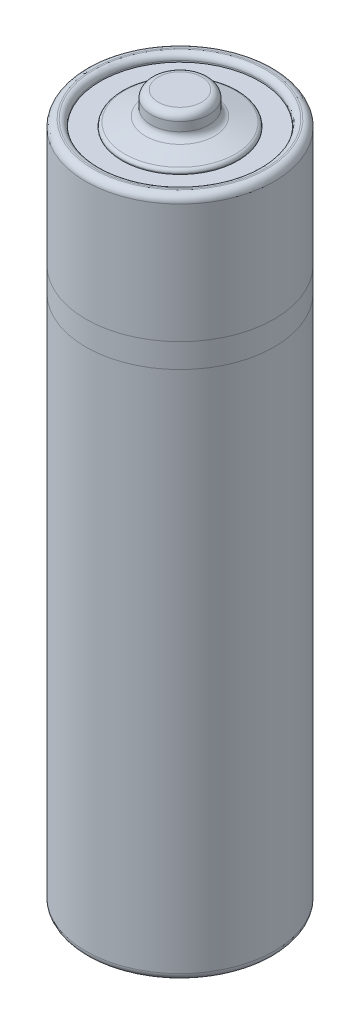
ISO-10303-21;
HEADER;
FILE_DESCRIPTION(('STEP AP214'),'2;1');
FILE_NAME('part.step','',(''),(''),'','','');
FILE_SCHEMA(('AUTOMOTIVE_DESIGN { 1 0 10303 214 1 1 1 1 }'));
ENDSEC;
DATA;
#1=APPLICATION_CONTEXT('core data for automotive mechanical design processes');
#2=APPLICATION_PROTOCOL_DEFINITION('international standard','automotive_design',2000,#1);
#3=PRODUCT_CONTEXT('',#1,'mechanical');
#4=PRODUCT('Part','Part','',(#3));
#5=PRODUCT_RELATED_PRODUCT_CATEGORY('part','',(#4));
#6=PRODUCT_DEFINITION_FORMATION('','',#4);
#7=PRODUCT_DEFINITION_CONTEXT('part definition',#1,'design');
#8=PRODUCT_DEFINITION('design','',#6,#7);
#9=PRODUCT_DEFINITION_SHAPE('','',#8);
#10=(LENGTH_UNIT() NAMED_UNIT(*) SI_UNIT(.MILLI.,.METRE.));
#11=(NAMED_UNIT(*) PLANE_ANGLE_UNIT() SI_UNIT($,.RADIAN.));
#12=(NAMED_UNIT(*) SI_UNIT($,.STERADIAN.) SOLID_ANGLE_UNIT());
#13=UNCERTAINTY_MEASURE_WITH_UNIT(LENGTH_MEASURE(1.E-05),#10,'distance_accuracy_value','');
#14=(GEOMETRIC_REPRESENTATION_CONTEXT(3) GLOBAL_UNCERTAINTY_ASSIGNED_CONTEXT((#13)) GLOBAL_UNIT_ASSIGNED_CONTEXT((#10,
#11,#12)) REPRESENTATION_CONTEXT('',''));
#15=CARTESIAN_POINT('',(0.,0.,0.));
#16=DIRECTION('',(0.,0.,1.));
#17=DIRECTION('',(1.,0.,0.));
#18=AXIS2_PLACEMENT_3D('',#15,#16,#17);
#19=CARTESIAN_POINT('',(0.,54.3178324547757,0.));
#20=DIRECTION('',(0.,1.,0.));
#21=DIRECTION('',(0.,0.,1.));
#22=AXIS2_PLACEMENT_3D('',#19,#20,#21);
#23=CYLINDRICAL_SURFACE('',#22,6.5);
#24=CARTESIAN_POINT('',(0.,-23.825,0.));
#25=DIRECTION('',(0.,1.,0.));
#26=DIRECTION('',(0.,0.,1.));
#27=AXIS2_PLACEMENT_3D('',#24,#25,#26);
#28=CIRCLE('',#27,6.5);
#29=CARTESIAN_POINT('',(0.,-23.825,6.5));
#30=VERTEX_POINT('',#29);
#31=EDGE_CURVE('E72',#30,#30,#28,.T.);
#32=ORIENTED_EDGE('',*,*,#31,.T.);
#33=EDGE_LOOP('',(#32));
#34=FACE_BOUND('',#33,.T.);
#35=CARTESIAN_POINT('',(0.,12.282906776427,0.));
#36=DIRECTION('',(0.,1.,0.));
#37=DIRECTION('',(0.,0.,1.));
#38=AXIS2_PLACEMENT_3D('',#35,#36,#37);
#39=CIRCLE('',#38,6.5);
#40=CARTESIAN_POINT('',(0.,12.282906776427,6.5));
#41=VERTEX_POINT('',#40);
#42=EDGE_CURVE('E10',#41,#41,#39,.T.);
#43=ORIENTED_EDGE('',*,*,#42,.F.);
#44=EDGE_LOOP('',(#43));
#45=FACE_BOUND('',#44,.T.);
#46=ADVANCED_FACE('F34',(#34,#45),#23,.T.);
#47=CARTESIAN_POINT('',(0.,22.175,0.));
#48=DIRECTION('',(0.,-1.,0.));
#49=DIRECTION('',(0.,0.,-1.));
#50=AXIS2_PLACEMENT_3D('',#47,#48,#49);
#51=CIRCLE('',#50,6.5);
#52=CARTESIAN_POINT('',(0.,22.175,-6.5));
#53=VERTEX_POINT('',#52);
#54=EDGE_CURVE('E99',#53,#53,#51,.T.);
#55=ORIENTED_EDGE('',*,*,#54,.T.);
#56=EDGE_LOOP('',(#55));
#57=FACE_BOUND('',#56,.T.);
#58=CARTESIAN_POINT('',(0.,13.9515340667371,0.));
#59=DIRECTION('',(0.,-1.,0.));
#60=DIRECTION('',(0.,0.,-1.));
#61=AXIS2_PLACEMENT_3D('',#58,#59,#60);
#62=CIRCLE('',#61,6.5);
#63=CARTESIAN_POINT('',(0.,13.9515340667371,-6.5));
#64=VERTEX_POINT('',#63);
#65=EDGE_CURVE('E42',#64,#64,#62,.T.);
#66=ORIENTED_EDGE('',*,*,#65,.F.);
#67=EDGE_LOOP('',(#66));
#68=FACE_BOUND('',#67,.T.);
#69=ADVANCED_FACE('F141',(#57,#68),#23,.T.);
#70=CARTESIAN_POINT('',(0.,-24.425,0.));
#71=DIRECTION('',(0.,1.,0.));
#72=DIRECTION('',(0.,0.,1.));
#73=AXIS2_PLACEMENT_3D('',#70,#71,#72);
#74=PLANE('',#73);
#75=CARTESIAN_POINT('',(0.,-24.425,0.));
#76=DIRECTION('',(0.,1.,0.));
#77=DIRECTION('',(0.,0.,1.));
#78=AXIS2_PLACEMENT_3D('',#75,#76,#77);
#79=CIRCLE('',#78,0.749999999999992);
#80=CARTESIAN_POINT('',(0.,-24.425,0.749999999999992));
#81=VERTEX_POINT('',#80);
#82=EDGE_CURVE('E105',#81,#81,#79,.T.);
#83=ORIENTED_EDGE('',*,*,#82,.F.);
#84=EDGE_LOOP('',(#83));
#85=FACE_BOUND('',#84,.T.);
#86=ADVANCED_FACE('F147',(#85),#74,.F.);
#87=CARTESIAN_POINT('',(0.749999999999992,-24.175,0.));
#88=DIRECTION('',(0.,1.,0.));
#89=DIRECTION('',(0.,0.,1.));
#90=AXIS2_PLACEMENT_3D('',#87,#88,#89);
#91=PLANE('',#90);
#92=CARTESIAN_POINT('',(0.,-24.175,0.));
#93=DIRECTION('',(0.,1.,0.));
#94=DIRECTION('',(0.,0.,1.));
#95=AXIS2_PLACEMENT_3D('',#92,#93,#94);
#96=CIRCLE('',#95,0.999999999999987);
#97=CARTESIAN_POINT('',(0.,-24.175,0.999999999999987));
#98=VERTEX_POINT('',#97);
#99=EDGE_CURVE('E49',#98,#98,#96,.T.);
#100=ORIENTED_EDGE('',*,*,#99,.T.);
#101=EDGE_LOOP('',(#100));
#102=FACE_BOUND('',#101,.T.);
#103=CARTESIAN_POINT('',(0.,-24.175,0.));
#104=DIRECTION('',(0.,1.,0.));
#105=DIRECTION('',(0.,0.,1.));
#106=AXIS2_PLACEMENT_3D('',#103,#104,#105);
#107=CIRCLE('',#106,2.15000000000001);
#108=CARTESIAN_POINT('',(0.,-24.175,2.15000000000001));
#109=VERTEX_POINT('',#108);
#110=EDGE_CURVE('E55',#109,#109,#107,.F.);
#111=ORIENTED_EDGE('',*,*,#110,.T.);
#112=EDGE_LOOP('',(#111));
#113=FACE_BOUND('',#112,.T.);
#114=ADVANCED_FACE('F168',(#102,#113),#91,.F.);
#115=CARTESIAN_POINT('',(1.5,-24.525,0.));
#116=DIRECTION('',(0.,1.,0.));
#117=DIRECTION('',(0.,0.,1.));
#118=AXIS2_PLACEMENT_3D('',#115,#116,#117);
#119=PLANE('',#118);
#120=CARTESIAN_POINT('',(0.,-24.525,0.));
#121=DIRECTION('',(0.,1.,0.));
#122=DIRECTION('',(0.,0.,1.));
#123=AXIS2_PLACEMENT_3D('',#120,#121,#122);
#124=CIRCLE('',#123,2.50000000000001);
#125=CARTESIAN_POINT('',(0.,-24.525,2.50000000000001));
#126=VERTEX_POINT('',#125);
#127=EDGE_CURVE('E60',#126,#126,#124,.T.);
#128=ORIENTED_EDGE('',*,*,#127,.T.);
#129=EDGE_LOOP('',(#128));
#130=FACE_BOUND('',#129,.T.);
#131=CARTESIAN_POINT('',(0.,-24.525,0.));
#132=DIRECTION('',(0.,1.,0.));
#133=DIRECTION('',(0.,0.,1.));
#134=AXIS2_PLACEMENT_3D('',#131,#132,#133);
#135=CIRCLE('',#134,3.99999999999998);
#136=CARTESIAN_POINT('',(0.,-24.525,3.99999999999998));
#137=VERTEX_POINT('',#136);
#138=EDGE_CURVE('E63',#137,#137,#135,.F.);
#139=ORIENTED_EDGE('',*,*,#138,.T.);
#140=EDGE_LOOP('',(#139));
#141=FACE_BOUND('',#140,.T.);
#142=ADVANCED_FACE('F161',(#130,#141),#119,.F.);
#143=CARTESIAN_POINT('',(4.5,-24.025,0.));
#144=DIRECTION('',(0.,1.,0.));
#145=DIRECTION('',(0.,0.,1.));
#146=AXIS2_PLACEMENT_3D('',#143,#144,#145);
#147=PLANE('',#146);
#148=CARTESIAN_POINT('',(0.,-24.025,0.));
#149=DIRECTION('',(0.,1.,0.));
#150=DIRECTION('',(0.,0.,1.));
#151=AXIS2_PLACEMENT_3D('',#148,#149,#150);
#152=CIRCLE('',#151,5.5);
#153=CARTESIAN_POINT('',(0.,-24.025,5.5));
#154=VERTEX_POINT('',#153);
#155=EDGE_CURVE('E111',#154,#154,#152,.T.);
#156=ORIENTED_EDGE('',*,*,#155,.F.);
#157=EDGE_LOOP('',(#156));
#158=FACE_BOUND('',#157,.T.);
#159=CARTESIAN_POINT('',(0.,-24.025,0.));
#160=DIRECTION('',(0.,1.,0.));
#161=DIRECTION('',(0.,0.,1.));
#162=AXIS2_PLACEMENT_3D('',#159,#160,#161);
#163=CIRCLE('',#162,4.5);
#164=CARTESIAN_POINT('',(0.,-24.025,4.5));
#165=VERTEX_POINT('',#164);
#166=EDGE_CURVE('E108',#165,#165,#163,.T.);
#167=ORIENTED_EDGE('',*,*,#166,.T.);
#168=EDGE_LOOP('',(#167));
#169=FACE_BOUND('',#168,.T.);
#170=ADVANCED_FACE('F156',(#158,#169),#147,.F.);
#171=CARTESIAN_POINT('',(5.5,-24.325,0.));
#172=DIRECTION('',(0.,1.,0.));
#173=DIRECTION('',(0.,0.,1.));
#174=AXIS2_PLACEMENT_3D('',#171,#172,#173);
#175=PLANE('',#174);
#176=CARTESIAN_POINT('',(0.,-24.325,0.));
#177=DIRECTION('',(0.,1.,0.));
#178=DIRECTION('',(0.,0.,1.));
#179=AXIS2_PLACEMENT_3D('',#176,#177,#178);
#180=CIRCLE('',#179,5.8);
#181=CARTESIAN_POINT('',(0.,-24.325,5.8));
#182=VERTEX_POINT('',#181);
#183=EDGE_CURVE('E66',#182,#182,#180,.T.);
#184=ORIENTED_EDGE('',*,*,#183,.T.);
#185=EDGE_LOOP('',(#184));
#186=FACE_BOUND('',#185,.T.);
#187=CARTESIAN_POINT('',(0.,-24.325,0.));
#188=DIRECTION('',(0.,1.,0.));
#189=DIRECTION('',(0.,0.,1.));
#190=AXIS2_PLACEMENT_3D('',#187,#188,#189);
#191=CIRCLE('',#190,6.);
#192=CARTESIAN_POINT('',(0.,-24.325,6.));
#193=VERTEX_POINT('',#192);
#194=EDGE_CURVE('E69',#193,#193,#191,.F.);
#195=ORIENTED_EDGE('',*,*,#194,.T.);
#196=EDGE_LOOP('',(#195));
#197=FACE_BOUND('',#196,.T.);
#198=ADVANCED_FACE('F152',(#186,#197),#175,.F.);
#199=ORIENTED_EDGE('',*,*,#42,.T.);
#200=EDGE_LOOP('',(#199));
#201=FACE_BOUND('',#200,.T.);
#202=ORIENTED_EDGE('',*,*,#65,.T.);
#203=EDGE_LOOP('',(#202));
#204=FACE_BOUND('',#203,.T.);
#205=ADVANCED_FACE('F137',(#201,#204),#23,.T.);
#206=CARTESIAN_POINT('',(6.5,22.675,0.));
#207=DIRECTION('',(0.,-1.,0.));
#208=DIRECTION('',(0.,0.,-1.));
#209=AXIS2_PLACEMENT_3D('',#206,#207,#208);
#210=PLANE('',#209);
#211=CARTESIAN_POINT('',(0.,22.675,0.));
#212=DIRECTION('',(0.,-1.,0.));
#213=DIRECTION('',(0.,0.,-1.));
#214=AXIS2_PLACEMENT_3D('',#211,#212,#213);
#215=CIRCLE('',#214,5.9);
#216=CARTESIAN_POINT('',(0.,22.675,-5.9));
#217=VERTEX_POINT('',#216);
#218=EDGE_CURVE('E93',#217,#217,#215,.T.);
#219=ORIENTED_EDGE('',*,*,#218,.T.);
#220=EDGE_LOOP('',(#219));
#221=FACE_BOUND('',#220,.T.);
#222=CARTESIAN_POINT('',(0.,22.675,0.));
#223=DIRECTION('',(0.,-1.,0.));
#224=DIRECTION('',(0.,0.,-1.));
#225=AXIS2_PLACEMENT_3D('',#222,#223,#224);
#226=CIRCLE('',#225,6.);
#227=CARTESIAN_POINT('',(0.,22.675,-6.));
#228=VERTEX_POINT('',#227);
#229=EDGE_CURVE('E102',#228,#228,#226,.F.);
#230=ORIENTED_EDGE('',*,*,#229,.T.);
#231=EDGE_LOOP('',(#230));
#232=FACE_BOUND('',#231,.T.);
#233=ADVANCED_FACE('F131',(#221,#232),#210,.F.);
#234=CARTESIAN_POINT('',(0.,54.3178324547757,0.));
#235=DIRECTION('',(0.,1.,0.));
#236=DIRECTION('',(0.,0.,1.));
#237=AXIS2_PLACEMENT_3D('',#234,#235,#236);
#238=CYLINDRICAL_SURFACE('',#237,5.5);
#239=CARTESIAN_POINT('',(0.,22.275,0.));
#240=DIRECTION('',(0.,-1.,0.));
#241=DIRECTION('',(0.,0.,-1.));
#242=AXIS2_PLACEMENT_3D('',#239,#240,#241);
#243=CIRCLE('',#242,5.5);
#244=CARTESIAN_POINT('',(0.,22.275,-5.5));
#245=VERTEX_POINT('',#244);
#246=EDGE_CURVE('E96',#245,#245,#243,.F.);
#247=ORIENTED_EDGE('',*,*,#246,.T.);
#248=EDGE_LOOP('',(#247));
#249=FACE_BOUND('',#248,.T.);
#250=CARTESIAN_POINT('',(0.,22.175,0.));
#251=DIRECTION('',(0.,1.,0.));
#252=DIRECTION('',(0.,0.,1.));
#253=AXIS2_PLACEMENT_3D('',#250,#251,#252);
#254=CIRCLE('',#253,5.5);
#255=CARTESIAN_POINT('',(0.,22.175,5.5));
#256=VERTEX_POINT('',#255);
#257=EDGE_CURVE('E114',#256,#256,#254,.T.);
#258=ORIENTED_EDGE('',*,*,#257,.F.);
#259=EDGE_LOOP('',(#258));
#260=FACE_BOUND('',#259,.T.);
#261=ADVANCED_FACE('F126',(#249,#260),#238,.F.);
#262=CARTESIAN_POINT('',(5.5,22.175,0.));
#263=DIRECTION('',(0.,-1.,0.));
#264=DIRECTION('',(0.,0.,-1.));
#265=AXIS2_PLACEMENT_3D('',#262,#263,#264);
#266=PLANE('',#265);
#267=CARTESIAN_POINT('',(0.,22.175,0.));
#268=DIRECTION('',(0.,1.,0.));
#269=DIRECTION('',(0.,0.,1.));
#270=AXIS2_PLACEMENT_3D('',#267,#268,#269);
#271=CIRCLE('',#270,3.99999999999999);
#272=CARTESIAN_POINT('',(0.,22.175,3.99999999999999));
#273=VERTEX_POINT('',#272);
#274=EDGE_CURVE('E117',#273,#273,#271,.T.);
#275=ORIENTED_EDGE('',*,*,#274,.F.);
#276=EDGE_LOOP('',(#275));
#277=FACE_BOUND('',#276,.T.);
#278=ORIENTED_EDGE('',*,*,#257,.T.);
#279=EDGE_LOOP('',(#278));
#280=FACE_BOUND('',#279,.T.);
#281=ADVANCED_FACE('F123',(#277,#280),#266,.F.);
#282=CARTESIAN_POINT('',(0.,54.3178324547757,0.));
#283=DIRECTION('',(0.,1.,0.));
#284=DIRECTION('',(0.,0.,1.));
#285=AXIS2_PLACEMENT_3D('',#282,#283,#284);
#286=CYLINDRICAL_SURFACE('',#285,3.99999999999999);
#287=CARTESIAN_POINT('',(0.,22.2298058983989,0.));
#288=DIRECTION('',(0.,-1.,0.));
#289=DIRECTION('',(0.,0.,-1.));
#290=AXIS2_PLACEMENT_3D('',#287,#288,#289);
#291=CIRCLE('',#290,3.99999999999999);
#292=CARTESIAN_POINT('',(0.,22.2298058983989,-3.99999999999999));
#293=VERTEX_POINT('',#292);
#294=EDGE_CURVE('E87',#293,#293,#291,.T.);
#295=ORIENTED_EDGE('',*,*,#294,.T.);
#296=EDGE_LOOP('',(#295));
#297=FACE_BOUND('',#296,.T.);
#298=ORIENTED_EDGE('',*,*,#274,.T.);
#299=EDGE_LOOP('',(#298));
#300=FACE_BOUND('',#299,.T.);
#301=ADVANCED_FACE('F121',(#297,#300),#286,.T.);
#302=CARTESIAN_POINT('',(0.,22.425,0.));
#303=DIRECTION('',(0.,-1.,0.));
#304=DIRECTION('',(0.,0.,-1.));
#305=AXIS2_PLACEMENT_3D('',#302,#303,#304);
#306=CONICAL_SURFACE('',#305,4.,1.32581766366803);
#307=CARTESIAN_POINT('',(0.,22.8303169531295,0.));
#308=DIRECTION('',(0.,-1.,0.));
#309=DIRECTION('',(0.,0.,-1.));
#310=AXIS2_PLACEMENT_3D('',#307,#308,#309);
#311=CIRCLE('',#310,2.37873218748183);
#312=CARTESIAN_POINT('',(0.,22.8303169531295,-2.37873218748183));
#313=VERTEX_POINT('',#312);
#314=EDGE_CURVE('E81',#313,#313,#311,.T.);
#315=ORIENTED_EDGE('',*,*,#314,.T.);
#316=EDGE_LOOP('',(#315));
#317=FACE_BOUND('',#316,.T.);
#318=CARTESIAN_POINT('',(0.,22.4723415234352,0.));
#319=DIRECTION('',(0.,1.,0.));
#320=DIRECTION('',(0.,0.,1.));
#321=AXIS2_PLACEMENT_3D('',#318,#319,#320);
#322=CIRCLE('',#321,3.81063390625908);
#323=CARTESIAN_POINT('',(0.,22.4723415234352,3.81063390625908));
#324=VERTEX_POINT('',#323);
#325=EDGE_CURVE('E90',#324,#324,#322,.T.);
#326=ORIENTED_EDGE('',*,*,#325,.T.);
#327=EDGE_LOOP('',(#326));
#328=FACE_BOUND('',#327,.T.);
#329=ADVANCED_FACE('F339',(#317,#328),#306,.T.);
#330=CARTESIAN_POINT('',(0.,54.3178324547757,0.));
#331=DIRECTION('',(0.,1.,0.));
#332=DIRECTION('',(0.,0.,1.));
#333=AXIS2_PLACEMENT_3D('',#330,#331,#332);
#334=CYLINDRICAL_SURFACE('',#333,2.);
#335=CARTESIAN_POINT('',(0.,23.925,0.));
#336=DIRECTION('',(0.,-1.,0.));
#337=DIRECTION('',(0.,0.,-1.));
#338=AXIS2_PLACEMENT_3D('',#335,#336,#337);
#339=CIRCLE('',#338,2.);
#340=CARTESIAN_POINT('',(0.,23.925,-2.));
#341=VERTEX_POINT('',#340);
#342=EDGE_CURVE('E75',#341,#341,#339,.T.);
#343=ORIENTED_EDGE('',*,*,#342,.T.);
#344=EDGE_LOOP('',(#343));
#345=FACE_BOUND('',#344,.T.);
#346=CARTESIAN_POINT('',(0.,23.3153882032022,0.));
#347=DIRECTION('',(0.,1.,0.));
#348=DIRECTION('',(0.,0.,1.));
#349=AXIS2_PLACEMENT_3D('',#346,#347,#348);
#350=CIRCLE('',#349,2.);
#351=CARTESIAN_POINT('',(0.,23.3153882032022,2.));
#352=VERTEX_POINT('',#351);
#353=EDGE_CURVE('E84',#352,#352,#350,.T.);
#354=ORIENTED_EDGE('',*,*,#353,.T.);
#355=EDGE_LOOP('',(#354));
#356=FACE_BOUND('',#355,.T.);
#357=ADVANCED_FACE('F330',(#345,#356),#334,.T.);
#358=CARTESIAN_POINT('',(2.,24.425,0.));
#359=DIRECTION('',(0.,-1.,0.));
#360=DIRECTION('',(0.,0.,-1.));
#361=AXIS2_PLACEMENT_3D('',#358,#359,#360);
#362=PLANE('',#361);
#363=CARTESIAN_POINT('',(0.,24.425,0.));
#364=DIRECTION('',(0.,-1.,0.));
#365=DIRECTION('',(0.,0.,-1.));
#366=AXIS2_PLACEMENT_3D('',#363,#364,#365);
#367=CIRCLE('',#366,1.5);
#368=CARTESIAN_POINT('',(0.,24.425,-1.5));
#369=VERTEX_POINT('',#368);
#370=EDGE_CURVE('E78',#369,#369,#367,.F.);
#371=ORIENTED_EDGE('',*,*,#370,.T.);
#372=EDGE_LOOP('',(#371));
#373=FACE_BOUND('',#372,.T.);
#374=ADVANCED_FACE('F180',(#373),#362,.F.);
#375=CARTESIAN_POINT('',(0.,22.175,0.));
#376=DIRECTION('',(0.,-1.,0.));
#377=DIRECTION('',(0.,0.,-1.));
#378=AXIS2_PLACEMENT_3D('',#375,#376,#377);
#379=TOROIDAL_SURFACE('',#378,6.,0.5);
#380=ORIENTED_EDGE('',*,*,#54,.F.);
#381=EDGE_LOOP('',(#380));
#382=FACE_BOUND('',#381,.T.);
#383=ORIENTED_EDGE('',*,*,#229,.F.);
#384=EDGE_LOOP('',(#383));
#385=FACE_BOUND('',#384,.T.);
#386=ADVANCED_FACE('F176',(#382,#385),#379,.T.);
#387=CARTESIAN_POINT('',(0.,22.275,0.));
#388=DIRECTION('',(0.,-1.,0.));
#389=DIRECTION('',(0.,0.,-1.));
#390=AXIS2_PLACEMENT_3D('',#387,#388,#389);
#391=TOROIDAL_SURFACE('',#390,5.9,0.4);
#392=ORIENTED_EDGE('',*,*,#218,.F.);
#393=EDGE_LOOP('',(#392));
#394=FACE_BOUND('',#393,.T.);
#395=ORIENTED_EDGE('',*,*,#246,.F.);
#396=EDGE_LOOP('',(#395));
#397=FACE_BOUND('',#396,.T.);
#398=ADVANCED_FACE('F179',(#394,#397),#391,.T.);
#399=CARTESIAN_POINT('',(0.,22.2298058983989,0.));
#400=DIRECTION('',(0.,-1.,0.));
#401=DIRECTION('',(0.,0.,-1.));
#402=AXIS2_PLACEMENT_3D('',#399,#400,#401);
#403=TOROIDAL_SURFACE('',#402,3.74999999999999,0.25);
#404=ORIENTED_EDGE('',*,*,#294,.F.);
#405=EDGE_LOOP('',(#404));
#406=FACE_BOUND('',#405,.T.);
#407=ORIENTED_EDGE('',*,*,#325,.F.);
#408=EDGE_LOOP('',(#407));
#409=FACE_BOUND('',#408,.T.);
#410=ADVANCED_FACE('F184',(#406,#409),#403,.T.);
#411=CARTESIAN_POINT('',(0.,23.3153882032022,0.));
#412=DIRECTION('',(0.,1.,0.));
#413=DIRECTION('',(0.,0.,1.));
#414=AXIS2_PLACEMENT_3D('',#411,#412,#413);
#415=TOROIDAL_SURFACE('',#414,2.5,0.5);
#416=ORIENTED_EDGE('',*,*,#314,.F.);
#417=EDGE_LOOP('',(#416));
#418=FACE_BOUND('',#417,.T.);
#419=ORIENTED_EDGE('',*,*,#353,.F.);
#420=EDGE_LOOP('',(#419));
#421=FACE_BOUND('',#420,.T.);
#422=ADVANCED_FACE('F188',(#418,#421),#415,.F.);
#423=CARTESIAN_POINT('',(0.,23.925,0.));
#424=DIRECTION('',(0.,-1.,0.));
#425=DIRECTION('',(0.,0.,-1.));
#426=AXIS2_PLACEMENT_3D('',#423,#424,#425);
#427=TOROIDAL_SURFACE('',#426,1.5,0.5);
#428=ORIENTED_EDGE('',*,*,#342,.F.);
#429=EDGE_LOOP('',(#428));
#430=FACE_BOUND('',#429,.T.);
#431=ORIENTED_EDGE('',*,*,#370,.F.);
#432=EDGE_LOOP('',(#431));
#433=FACE_BOUND('',#432,.T.);
#434=ADVANCED_FACE('F192',(#430,#433),#427,.T.);
#435=CARTESIAN_POINT('',(0.,-23.825,0.));
#436=DIRECTION('',(0.,1.,0.));
#437=DIRECTION('',(0.,0.,1.));
#438=AXIS2_PLACEMENT_3D('',#435,#436,#437);
#439=TOROIDAL_SURFACE('',#438,6.,0.5);
#440=ORIENTED_EDGE('',*,*,#194,.F.);
#441=EDGE_LOOP('',(#440));
#442=FACE_BOUND('',#441,.T.);
#443=ORIENTED_EDGE('',*,*,#31,.F.);
#444=EDGE_LOOP('',(#443));
#445=FACE_BOUND('',#444,.T.);
#446=ADVANCED_FACE('F196',(#442,#445),#439,.T.);
#447=CARTESIAN_POINT('',(0.,-24.025,0.));
#448=DIRECTION('',(0.,1.,0.));
#449=DIRECTION('',(0.,0.,1.));
#450=AXIS2_PLACEMENT_3D('',#447,#448,#449);
#451=TOROIDAL_SURFACE('',#450,5.8,0.3);
#452=ORIENTED_EDGE('',*,*,#155,.T.);
#453=EDGE_LOOP('',(#452));
#454=FACE_BOUND('',#453,.T.);
#455=ORIENTED_EDGE('',*,*,#183,.F.);
#456=EDGE_LOOP('',(#455));
#457=FACE_BOUND('',#456,.T.);
#458=ADVANCED_FACE('F200',(#454,#457),#451,.T.);
#459=CARTESIAN_POINT('',(0.,-24.025,0.));
#460=DIRECTION('',(0.,1.,0.));
#461=DIRECTION('',(0.,0.,1.));
#462=AXIS2_PLACEMENT_3D('',#459,#460,#461);
#463=CONICAL_SURFACE('',#462,4.5,0.785398163397456);
#464=ORIENTED_EDGE('',*,*,#138,.F.);
#465=EDGE_LOOP('',(#464));
#466=FACE_BOUND('',#465,.T.);
#467=ORIENTED_EDGE('',*,*,#166,.F.);
#468=EDGE_LOOP('',(#467));
#469=FACE_BOUND('',#468,.T.);
#470=ADVANCED_FACE('F204',(#466,#469),#463,.T.);
#471=CARTESIAN_POINT('',(0.,-24.525,0.));
#472=DIRECTION('',(0.,-1.,0.));
#473=DIRECTION('',(0.,0.,-1.));
#474=AXIS2_PLACEMENT_3D('',#471,#472,#473);
#475=CONICAL_SURFACE('',#474,2.50000000000002,0.78539816339745);
#476=ORIENTED_EDGE('',*,*,#110,.F.);
#477=EDGE_LOOP('',(#476));
#478=FACE_BOUND('',#477,.T.);
#479=ORIENTED_EDGE('',*,*,#127,.F.);
#480=EDGE_LOOP('',(#479));
#481=FACE_BOUND('',#480,.T.);
#482=ADVANCED_FACE('F207',(#478,#481),#475,.F.);
#483=CARTESIAN_POINT('',(0.,-24.175,0.));
#484=DIRECTION('',(0.,1.,0.));
#485=DIRECTION('',(0.,0.,1.));
#486=AXIS2_PLACEMENT_3D('',#483,#484,#485);
#487=CONICAL_SURFACE('',#486,0.999999999999987,0.785398163397466);
#488=ORIENTED_EDGE('',*,*,#82,.T.);
#489=EDGE_LOOP('',(#488));
#490=FACE_BOUND('',#489,.T.);
#491=ORIENTED_EDGE('',*,*,#99,.F.);
#492=EDGE_LOOP('',(#491));
#493=FACE_BOUND('',#492,.T.);
#494=ADVANCED_FACE('F36',(#490,#493),#487,.T.);
#495=CLOSED_SHELL('',(#46,#69,#86,#114,#142,#170,#198,#205,#233,#261,#281,#301,#329,#357,#374,
#386,#398,#410,#422,#434,#446,#458,#470,#482,#494));
#496=MANIFOLD_SOLID_BREP('B2',#495);
#497=ADVANCED_BREP_SHAPE_REPRESENTATION('',(#18,#496),#14);
#498=SHAPE_DEFINITION_REPRESENTATION(#9,#497);
ENDSEC;
END-ISO-10303-21;
